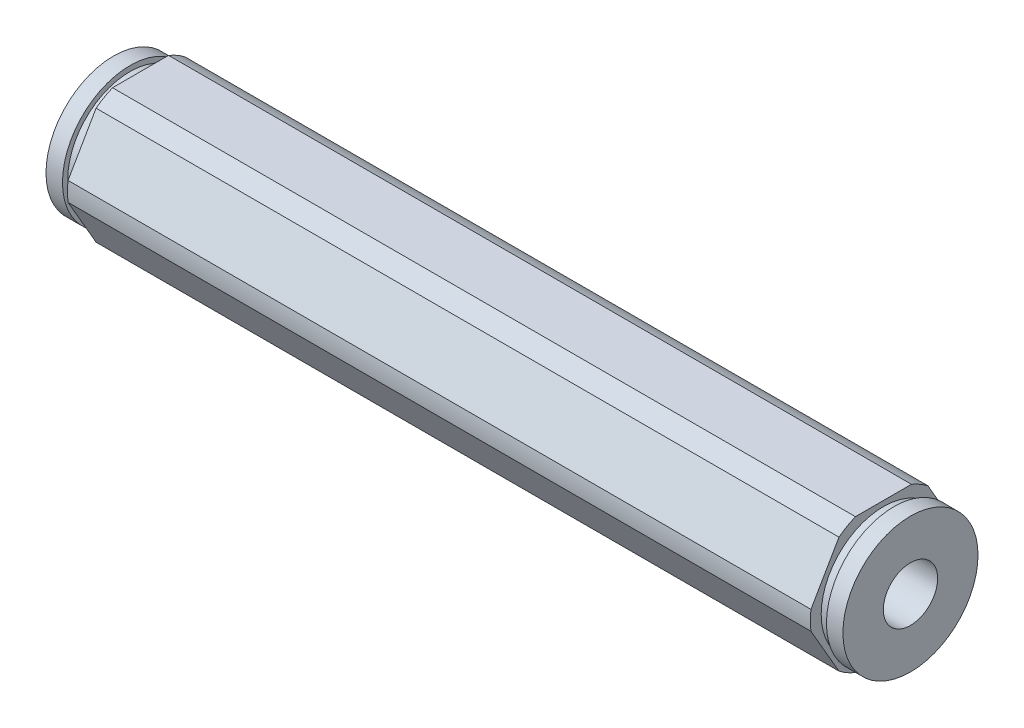
ISO-10303-21;
HEADER;
FILE_DESCRIPTION(('STEP AP214'),'2;1');
FILE_NAME('part.step','',(''),(''),'','','');
FILE_SCHEMA(('AUTOMOTIVE_DESIGN { 1 0 10303 214 1 1 1 1 }'));
ENDSEC;
DATA;
#1=APPLICATION_CONTEXT('core data for automotive mechanical design processes');
#2=APPLICATION_PROTOCOL_DEFINITION('international standard','automotive_design',2000,#1);
#3=PRODUCT_CONTEXT('',#1,'mechanical');
#4=PRODUCT('Part','Part','',(#3));
#5=PRODUCT_RELATED_PRODUCT_CATEGORY('part','',(#4));
#6=PRODUCT_DEFINITION_FORMATION('','',#4);
#7=PRODUCT_DEFINITION_CONTEXT('part definition',#1,'design');
#8=PRODUCT_DEFINITION('design','',#6,#7);
#9=PRODUCT_DEFINITION_SHAPE('','',#8);
#10=(LENGTH_UNIT() NAMED_UNIT(*) SI_UNIT(.MILLI.,.METRE.));
#11=(NAMED_UNIT(*) PLANE_ANGLE_UNIT() SI_UNIT($,.RADIAN.));
#12=(NAMED_UNIT(*) SI_UNIT($,.STERADIAN.) SOLID_ANGLE_UNIT());
#13=UNCERTAINTY_MEASURE_WITH_UNIT(LENGTH_MEASURE(1.E-05),#10,'distance_accuracy_value','');
#14=(GEOMETRIC_REPRESENTATION_CONTEXT(3) GLOBAL_UNCERTAINTY_ASSIGNED_CONTEXT((#13)) GLOBAL_UNIT_ASSIGNED_CONTEXT((#10,
#11,#12)) REPRESENTATION_CONTEXT('',''));
#15=CARTESIAN_POINT('',(0.,0.,0.));
#16=DIRECTION('',(0.,0.,1.));
#17=DIRECTION('',(1.,0.,0.));
#18=AXIS2_PLACEMENT_3D('',#15,#16,#17);
#19=CARTESIAN_POINT('',(37.465,-6.34999999999993,-3.66617420935418));
#20=DIRECTION('',(0.,0.499999999999995,0.866025403784441));
#21=DIRECTION('',(0.,-0.866025403784441,0.499999999999995));
#22=AXIS2_PLACEMENT_3D('',#19,#20,#21);
#23=PLANE('',#22);
#24=DIRECTION('',(1.,0.,0.));
#25=VECTOR('',#24,1.);
#26=CARTESIAN_POINT('',(-37.465,-5.4569605057932,-4.18177080173139));
#27=LINE('',#26,#25);
#28=CARTESIAN_POINT('',(-34.925,-5.4569605057932,-4.18177080173139));
#29=VERTEX_POINT('',#28);
#30=CARTESIAN_POINT('',(34.925,-5.4569605057932,-4.18177080173139));
#31=VERTEX_POINT('',#30);
#32=EDGE_CURVE('E252',#29,#31,#27,.T.);
#33=ORIENTED_EDGE('',*,*,#32,.F.);
#34=DIRECTION('',(0.,0.866025403784441,-0.499999999999995));
#35=VECTOR('',#34,1.);
#36=CARTESIAN_POINT('',(-34.925,-6.34999999999993,-3.66617420935418));
#37=LINE('',#36,#35);
#38=CARTESIAN_POINT('',(-34.925,-0.893039494206728,-6.816751826331));
#39=VERTEX_POINT('',#38);
#40=EDGE_CURVE('E149',#29,#39,#37,.T.);
#41=ORIENTED_EDGE('',*,*,#40,.T.);
#42=DIRECTION('',(1.,0.,0.));
#43=VECTOR('',#42,1.);
#44=CARTESIAN_POINT('',(-37.465,-0.893039494206728,-6.816751826331));
#45=LINE('',#44,#43);
#46=CARTESIAN_POINT('',(34.925,-0.893039494206728,-6.816751826331));
#47=VERTEX_POINT('',#46);
#48=EDGE_CURVE('E58',#47,#39,#45,.F.);
#49=ORIENTED_EDGE('',*,*,#48,.F.);
#50=DIRECTION('',(0.,-0.866025403784441,0.499999999999995));
#51=VECTOR('',#50,1.);
#52=CARTESIAN_POINT('',(34.925,-6.34999999999993,-3.66617420935418));
#53=LINE('',#52,#51);
#54=EDGE_CURVE('E177',#47,#31,#53,.T.);
#55=ORIENTED_EDGE('',*,*,#54,.T.);
#56=EDGE_LOOP('',(#33,#41,#49,#55));
#57=FACE_BOUND('',#56,.T.);
#58=ADVANCED_FACE('F43',(#57),#23,.F.);
#59=CARTESIAN_POINT('',(37.465,0.,-7.33234841870821));
#60=DIRECTION('',(0.,-0.500000000000001,0.866025403784438));
#61=DIRECTION('',(0.,-0.866025403784438,-0.500000000000001));
#62=AXIS2_PLACEMENT_3D('',#59,#60,#61);
#63=PLANE('',#62);
#64=DIRECTION('',(1.,0.,0.));
#65=VECTOR('',#64,1.);
#66=CARTESIAN_POINT('',(-37.465,0.893039494206712,-6.816751826331));
#67=LINE('',#66,#65);
#68=CARTESIAN_POINT('',(-34.925,0.893039494206712,-6.816751826331));
#69=VERTEX_POINT('',#68);
#70=CARTESIAN_POINT('',(34.925,0.893039494206712,-6.816751826331));
#71=VERTEX_POINT('',#70);
#72=EDGE_CURVE('E130',#69,#71,#67,.T.);
#73=ORIENTED_EDGE('',*,*,#72,.F.);
#74=DIRECTION('',(0.,0.866025403784438,0.500000000000001));
#75=VECTOR('',#74,1.);
#76=CARTESIAN_POINT('',(-34.925,0.,-7.33234841870821));
#77=LINE('',#76,#75);
#78=CARTESIAN_POINT('',(-34.925,5.45696050579327,-4.1817708017313));
#79=VERTEX_POINT('',#78);
#80=EDGE_CURVE('E142',#69,#79,#77,.T.);
#81=ORIENTED_EDGE('',*,*,#80,.T.);
#82=DIRECTION('',(1.,0.,0.));
#83=VECTOR('',#82,1.);
#84=CARTESIAN_POINT('',(-37.465,5.45696050579327,-4.1817708017313));
#85=LINE('',#84,#83);
#86=CARTESIAN_POINT('',(34.925,5.45696050579327,-4.1817708017313));
#87=VERTEX_POINT('',#86);
#88=EDGE_CURVE('E65',#87,#79,#85,.F.);
#89=ORIENTED_EDGE('',*,*,#88,.F.);
#90=DIRECTION('',(0.,-0.866025403784438,-0.500000000000001));
#91=VECTOR('',#90,1.);
#92=CARTESIAN_POINT('',(34.925,0.,-7.33234841870821));
#93=LINE('',#92,#91);
#94=EDGE_CURVE('E144',#87,#71,#93,.T.);
#95=ORIENTED_EDGE('',*,*,#94,.T.);
#96=EDGE_LOOP('',(#73,#81,#89,#95));
#97=FACE_BOUND('',#96,.T.);
#98=ADVANCED_FACE('F141',(#97),#63,.F.);
#99=CARTESIAN_POINT('',(37.465,6.34999999999998,-3.66617420935409));
#100=DIRECTION('',(0.,-1.,0.));
#101=DIRECTION('',(0.,0.,-1.));
#102=AXIS2_PLACEMENT_3D('',#99,#100,#101);
#103=PLANE('',#102);
#104=DIRECTION('',(1.,0.,0.));
#105=VECTOR('',#104,1.);
#106=CARTESIAN_POINT('',(-37.465,6.34999999999997,-2.63498102459967));
#107=LINE('',#106,#105);
#108=CARTESIAN_POINT('',(-34.925,6.34999999999997,-2.63498102459967));
#109=VERTEX_POINT('',#108);
#110=CARTESIAN_POINT('',(34.925,6.34999999999997,-2.63498102459967));
#111=VERTEX_POINT('',#110);
#112=EDGE_CURVE('E239',#109,#111,#107,.T.);
#113=ORIENTED_EDGE('',*,*,#112,.F.);
#114=DIRECTION('',(0.,0.,1.));
#115=VECTOR('',#114,1.);
#116=CARTESIAN_POINT('',(-34.925,6.34999999999998,-3.66617420935409));
#117=LINE('',#116,#115);
#118=CARTESIAN_POINT('',(-34.925,6.34999999999996,2.63498102459971));
#119=VERTEX_POINT('',#118);
#120=EDGE_CURVE('E150',#109,#119,#117,.T.);
#121=ORIENTED_EDGE('',*,*,#120,.T.);
#122=DIRECTION('',(1.,0.,0.));
#123=VECTOR('',#122,1.);
#124=CARTESIAN_POINT('',(-37.465,6.34999999999996,2.63498102459971));
#125=LINE('',#124,#123);
#126=CARTESIAN_POINT('',(34.925,6.34999999999996,2.63498102459971));
#127=VERTEX_POINT('',#126);
#128=EDGE_CURVE('E216',#127,#119,#125,.F.);
#129=ORIENTED_EDGE('',*,*,#128,.F.);
#130=DIRECTION('',(0.,0.,-1.));
#131=VECTOR('',#130,1.);
#132=CARTESIAN_POINT('',(34.925,6.34999999999998,-3.66617420935409));
#133=LINE('',#132,#131);
#134=EDGE_CURVE('E173',#127,#111,#133,.T.);
#135=ORIENTED_EDGE('',*,*,#134,.T.);
#136=EDGE_LOOP('',(#113,#121,#129,#135));
#137=FACE_BOUND('',#136,.T.);
#138=ADVANCED_FACE('F304',(#137),#103,.F.);
#139=CARTESIAN_POINT('',(37.465,6.34999999999995,3.66617420935414));
#140=DIRECTION('',(0.,-0.499999999999995,-0.866025403784442));
#141=DIRECTION('',(0.,0.866025403784442,-0.499999999999995));
#142=AXIS2_PLACEMENT_3D('',#139,#140,#141);
#143=PLANE('',#142);
#144=DIRECTION('',(1.,0.,0.));
#145=VECTOR('',#144,1.);
#146=CARTESIAN_POINT('',(-37.465,5.45696050579324,4.18177080173134));
#147=LINE('',#146,#145);
#148=CARTESIAN_POINT('',(-34.925,5.45696050579324,4.18177080173134));
#149=VERTEX_POINT('',#148);
#150=CARTESIAN_POINT('',(34.925,5.45696050579324,4.18177080173134));
#151=VERTEX_POINT('',#150);
#152=EDGE_CURVE('E213',#149,#151,#147,.T.);
#153=ORIENTED_EDGE('',*,*,#152,.F.);
#154=DIRECTION('',(0.,-0.866025403784442,0.499999999999995));
#155=VECTOR('',#154,1.);
#156=CARTESIAN_POINT('',(-34.925,6.34999999999995,3.66617420935414));
#157=LINE('',#156,#155);
#158=CARTESIAN_POINT('',(-34.925,0.89303949420666,6.81675182633101));
#159=VERTEX_POINT('',#158);
#160=EDGE_CURVE('E155',#149,#159,#157,.T.);
#161=ORIENTED_EDGE('',*,*,#160,.T.);
#162=DIRECTION('',(1.,0.,0.));
#163=VECTOR('',#162,1.);
#164=CARTESIAN_POINT('',(-37.465,0.893039494206654,6.81675182633101));
#165=LINE('',#164,#163);
#166=CARTESIAN_POINT('',(34.925,0.893039494206654,6.81675182633101));
#167=VERTEX_POINT('',#166);
#168=EDGE_CURVE('E243',#167,#159,#165,.F.);
#169=ORIENTED_EDGE('',*,*,#168,.F.);
#170=DIRECTION('',(0.,0.866025403784442,-0.499999999999995));
#171=VECTOR('',#170,1.);
#172=CARTESIAN_POINT('',(34.925,6.34999999999995,3.66617420935414));
#173=LINE('',#172,#171);
#174=EDGE_CURVE('E170',#167,#151,#173,.T.);
#175=ORIENTED_EDGE('',*,*,#174,.T.);
#176=EDGE_LOOP('',(#153,#161,#169,#175));
#177=FACE_BOUND('',#176,.T.);
#178=ADVANCED_FACE('F220',(#177),#143,.F.);
#179=CARTESIAN_POINT('',(37.465,0.,7.33234841870821));
#180=DIRECTION('',(0.,0.500000000000007,-0.866025403784435));
#181=DIRECTION('',(0.,0.866025403784435,0.500000000000007));
#182=AXIS2_PLACEMENT_3D('',#179,#180,#181);
#183=PLANE('',#182);
#184=DIRECTION('',(1.,0.,0.));
#185=VECTOR('',#184,1.);
#186=CARTESIAN_POINT('',(-37.465,-0.893039494206757,6.81675182633099));
#187=LINE('',#186,#185);
#188=CARTESIAN_POINT('',(-34.925,-0.893039494206757,6.81675182633099));
#189=VERTEX_POINT('',#188);
#190=CARTESIAN_POINT('',(34.925,-0.893039494206757,6.81675182633099));
#191=VERTEX_POINT('',#190);
#192=EDGE_CURVE('E245',#189,#191,#187,.T.);
#193=ORIENTED_EDGE('',*,*,#192,.F.);
#194=DIRECTION('',(0.,-0.866025403784435,-0.500000000000007));
#195=VECTOR('',#194,1.);
#196=CARTESIAN_POINT('',(-34.925,0.,7.33234841870821));
#197=LINE('',#196,#195);
#198=CARTESIAN_POINT('',(-34.925,-5.4569605057933,4.18177080173127));
#199=VERTEX_POINT('',#198);
#200=EDGE_CURVE('E225',#189,#199,#197,.T.);
#201=ORIENTED_EDGE('',*,*,#200,.T.);
#202=DIRECTION('',(1.,0.,0.));
#203=VECTOR('',#202,1.);
#204=CARTESIAN_POINT('',(-37.465,-5.4569605057933,4.18177080173127));
#205=LINE('',#204,#203);
#206=CARTESIAN_POINT('',(34.925,-5.4569605057933,4.18177080173127));
#207=VERTEX_POINT('',#206);
#208=EDGE_CURVE('E248',#207,#199,#205,.F.);
#209=ORIENTED_EDGE('',*,*,#208,.F.);
#210=DIRECTION('',(0.,0.866025403784435,0.500000000000007));
#211=VECTOR('',#210,1.);
#212=CARTESIAN_POINT('',(34.925,0.,7.33234841870821));
#213=LINE('',#212,#211);
#214=EDGE_CURVE('E167',#207,#191,#213,.T.);
#215=ORIENTED_EDGE('',*,*,#214,.T.);
#216=EDGE_LOOP('',(#193,#201,#209,#215));
#217=FACE_BOUND('',#216,.T.);
#218=ADVANCED_FACE('F323',(#217),#183,.F.);
#219=CARTESIAN_POINT('',(37.465,-6.35,3.66617420935405));
#220=DIRECTION('',(0.,1.,0.));
#221=DIRECTION('',(0.,0.,1.));
#222=AXIS2_PLACEMENT_3D('',#219,#220,#221);
#223=PLANE('',#222);
#224=DIRECTION('',(1.,0.,0.));
#225=VECTOR('',#224,1.);
#226=CARTESIAN_POINT('',(-37.465,-6.34999999999999,2.63498102459963));
#227=LINE('',#226,#225);
#228=CARTESIAN_POINT('',(-34.925,-6.34999999999999,2.63498102459963));
#229=VERTEX_POINT('',#228);
#230=CARTESIAN_POINT('',(34.925,-6.34999999999999,2.63498102459963));
#231=VERTEX_POINT('',#230);
#232=EDGE_CURVE('E196',#229,#231,#227,.T.);
#233=ORIENTED_EDGE('',*,*,#232,.F.);
#234=DIRECTION('',(0.,0.,-1.));
#235=VECTOR('',#234,1.);
#236=CARTESIAN_POINT('',(-34.925,-6.35,3.66617420935405));
#237=LINE('',#236,#235);
#238=CARTESIAN_POINT('',(-34.925,-6.34999999999994,-2.63498102459976));
#239=VERTEX_POINT('',#238);
#240=EDGE_CURVE('E137',#229,#239,#237,.T.);
#241=ORIENTED_EDGE('',*,*,#240,.T.);
#242=DIRECTION('',(1.,0.,0.));
#243=VECTOR('',#242,1.);
#244=CARTESIAN_POINT('',(-37.465,-6.34999999999994,-2.63498102459976));
#245=LINE('',#244,#243);
#246=CARTESIAN_POINT('',(34.925,-6.34999999999994,-2.63498102459976));
#247=VERTEX_POINT('',#246);
#248=EDGE_CURVE('E194',#247,#239,#245,.F.);
#249=ORIENTED_EDGE('',*,*,#248,.F.);
#250=DIRECTION('',(0.,0.,1.));
#251=VECTOR('',#250,1.);
#252=CARTESIAN_POINT('',(34.925,-6.35,3.66617420935405));
#253=LINE('',#252,#251);
#254=EDGE_CURVE('E183',#247,#231,#253,.T.);
#255=ORIENTED_EDGE('',*,*,#254,.T.);
#256=EDGE_LOOP('',(#233,#241,#249,#255));
#257=FACE_BOUND('',#256,.T.);
#258=ADVANCED_FACE('F193',(#257),#223,.F.);
#259=CARTESIAN_POINT('',(34.925,0.,8.89));
#260=DIRECTION('',(-1.,0.,0.));
#261=DIRECTION('',(0.,0.,1.));
#262=AXIS2_PLACEMENT_3D('',#259,#260,#261);
#263=PLANE('',#262);
#264=CARTESIAN_POINT('',(34.925,0.,0.));
#265=DIRECTION('',(-1.,0.,0.));
#266=DIRECTION('',(0.,0.,1.));
#267=AXIS2_PLACEMENT_3D('',#264,#265,#266);
#268=CIRCLE('',#267,5.8547);
#269=CARTESIAN_POINT('',(34.925,0.,5.8547));
#270=VERTEX_POINT('',#269);
#271=EDGE_CURVE('E164',#270,#270,#268,.T.);
#272=ORIENTED_EDGE('',*,*,#271,.T.);
#273=EDGE_LOOP('',(#272));
#274=FACE_BOUND('',#273,.T.);
#275=CARTESIAN_POINT('',(34.925,0.,0.));
#276=DIRECTION('',(-1.,0.,0.));
#277=DIRECTION('',(0.,0.,1.));
#278=AXIS2_PLACEMENT_3D('',#275,#276,#277);
#279=CIRCLE('',#278,6.875);
#280=EDGE_CURVE('E241',#151,#127,#279,.T.);
#281=ORIENTED_EDGE('',*,*,#280,.F.);
#282=ORIENTED_EDGE('',*,*,#174,.F.);
#283=EDGE_CURVE('E223',#191,#167,#279,.T.);
#284=ORIENTED_EDGE('',*,*,#283,.F.);
#285=ORIENTED_EDGE('',*,*,#214,.F.);
#286=EDGE_CURVE('E247',#231,#207,#279,.T.);
#287=ORIENTED_EDGE('',*,*,#286,.F.);
#288=ORIENTED_EDGE('',*,*,#254,.F.);
#289=EDGE_CURVE('E251',#31,#247,#279,.T.);
#290=ORIENTED_EDGE('',*,*,#289,.F.);
#291=ORIENTED_EDGE('',*,*,#54,.F.);
#292=EDGE_CURVE('E255',#71,#47,#279,.T.);
#293=ORIENTED_EDGE('',*,*,#292,.F.);
#294=ORIENTED_EDGE('',*,*,#94,.F.);
#295=EDGE_CURVE('E237',#111,#87,#279,.T.);
#296=ORIENTED_EDGE('',*,*,#295,.F.);
#297=ORIENTED_EDGE('',*,*,#134,.F.);
#298=EDGE_LOOP('',(#281,#282,#284,#285,#287,#288,#290,#291,#293,#294,#296,#297));
#299=FACE_BOUND('',#298,.T.);
#300=ADVANCED_FACE('F309',(#274,#299),#263,.F.);
#301=CARTESIAN_POINT('',(-34.925,0.,8.89));
#302=DIRECTION('',(1.,0.,0.));
#303=DIRECTION('',(0.,0.,1.));
#304=AXIS2_PLACEMENT_3D('',#301,#302,#303);
#305=PLANE('',#304);
#306=CARTESIAN_POINT('',(-34.925,0.,0.));
#307=DIRECTION('',(-1.,0.,0.));
#308=DIRECTION('',(0.,0.,1.));
#309=AXIS2_PLACEMENT_3D('',#306,#307,#308);
#310=CIRCLE('',#309,5.8547);
#311=CARTESIAN_POINT('',(-34.925,0.,5.8547));
#312=VERTEX_POINT('',#311);
#313=EDGE_CURVE('E226',#312,#312,#310,.T.);
#314=ORIENTED_EDGE('',*,*,#313,.F.);
#315=EDGE_LOOP('',(#314));
#316=FACE_BOUND('',#315,.T.);
#317=CARTESIAN_POINT('',(-34.925,0.,0.));
#318=DIRECTION('',(1.,0.,0.));
#319=DIRECTION('',(0.,0.,-1.));
#320=AXIS2_PLACEMENT_3D('',#317,#318,#319);
#321=CIRCLE('',#320,6.875);
#322=EDGE_CURVE('E12',#79,#109,#321,.T.);
#323=ORIENTED_EDGE('',*,*,#322,.F.);
#324=ORIENTED_EDGE('',*,*,#80,.F.);
#325=EDGE_CURVE('E46',#39,#69,#321,.T.);
#326=ORIENTED_EDGE('',*,*,#325,.F.);
#327=ORIENTED_EDGE('',*,*,#40,.F.);
#328=EDGE_CURVE('E136',#239,#29,#321,.T.);
#329=ORIENTED_EDGE('',*,*,#328,.F.);
#330=ORIENTED_EDGE('',*,*,#240,.F.);
#331=EDGE_CURVE('E200',#199,#229,#321,.T.);
#332=ORIENTED_EDGE('',*,*,#331,.F.);
#333=ORIENTED_EDGE('',*,*,#200,.F.);
#334=EDGE_CURVE('E204',#159,#189,#321,.T.);
#335=ORIENTED_EDGE('',*,*,#334,.F.);
#336=ORIENTED_EDGE('',*,*,#160,.F.);
#337=EDGE_CURVE('E51',#119,#149,#321,.T.);
#338=ORIENTED_EDGE('',*,*,#337,.F.);
#339=ORIENTED_EDGE('',*,*,#120,.F.);
#340=EDGE_LOOP('',(#323,#324,#326,#327,#329,#330,#332,#333,#335,#336,#338,#339));
#341=FACE_BOUND('',#340,.T.);
#342=ADVANCED_FACE('F147',(#316,#341),#305,.F.);
#343=CARTESIAN_POINT('',(0.,0.,0.));
#344=DIRECTION('',(-1.,0.,0.));
#345=DIRECTION('',(0.,0.,1.));
#346=AXIS2_PLACEMENT_3D('',#343,#344,#345);
#347=CYLINDRICAL_SURFACE('',#346,6.35);
#348=CARTESIAN_POINT('',(37.465,0.,0.));
#349=DIRECTION('',(1.,0.,0.));
#350=DIRECTION('',(0.,0.,-1.));
#351=AXIS2_PLACEMENT_3D('',#348,#349,#350);
#352=CIRCLE('',#351,6.35);
#353=CARTESIAN_POINT('',(37.465,0.,-6.35));
#354=VERTEX_POINT('',#353);
#355=EDGE_CURVE('E180',#354,#354,#352,.F.);
#356=ORIENTED_EDGE('',*,*,#355,.T.);
#357=EDGE_LOOP('',(#356));
#358=FACE_BOUND('',#357,.T.);
#359=CARTESIAN_POINT('',(35.9156,0.,0.));
#360=DIRECTION('',(-1.,0.,0.));
#361=DIRECTION('',(0.,0.,1.));
#362=AXIS2_PLACEMENT_3D('',#359,#360,#361);
#363=CIRCLE('',#362,6.35);
#364=CARTESIAN_POINT('',(35.9156,0.,6.35));
#365=VERTEX_POINT('',#364);
#366=EDGE_CURVE('E152',#365,#365,#363,.T.);
#367=ORIENTED_EDGE('',*,*,#366,.F.);
#368=EDGE_LOOP('',(#367));
#369=FACE_BOUND('',#368,.T.);
#370=ADVANCED_FACE('F281',(#358,#369),#347,.T.);
#371=CARTESIAN_POINT('',(0.,0.,0.));
#372=DIRECTION('',(-1.,0.,0.));
#373=DIRECTION('',(0.,0.,1.));
#374=AXIS2_PLACEMENT_3D('',#371,#372,#373);
#375=CYLINDRICAL_SURFACE('',#374,5.8547);
#376=ORIENTED_EDGE('',*,*,#271,.F.);
#377=EDGE_LOOP('',(#376));
#378=FACE_BOUND('',#377,.T.);
#379=CARTESIAN_POINT('',(35.9156,0.,0.));
#380=DIRECTION('',(-1.,0.,0.));
#381=DIRECTION('',(0.,0.,1.));
#382=AXIS2_PLACEMENT_3D('',#379,#380,#381);
#383=CIRCLE('',#382,5.8547);
#384=CARTESIAN_POINT('',(35.9156,0.,5.8547));
#385=VERTEX_POINT('',#384);
#386=EDGE_CURVE('E161',#385,#385,#383,.T.);
#387=ORIENTED_EDGE('',*,*,#386,.T.);
#388=EDGE_LOOP('',(#387));
#389=FACE_BOUND('',#388,.T.);
#390=ADVANCED_FACE('F284',(#378,#389),#375,.T.);
#391=CARTESIAN_POINT('',(35.9156,0.,5.8547));
#392=DIRECTION('',(1.,0.,0.));
#393=DIRECTION('',(0.,0.,-1.));
#394=AXIS2_PLACEMENT_3D('',#391,#392,#393);
#395=PLANE('',#394);
#396=ORIENTED_EDGE('',*,*,#386,.F.);
#397=EDGE_LOOP('',(#396));
#398=FACE_BOUND('',#397,.T.);
#399=ORIENTED_EDGE('',*,*,#366,.T.);
#400=EDGE_LOOP('',(#399));
#401=FACE_BOUND('',#400,.T.);
#402=ADVANCED_FACE('F277',(#398,#401),#395,.F.);
#403=CARTESIAN_POINT('',(37.465,0.,0.));
#404=DIRECTION('',(1.,0.,0.));
#405=DIRECTION('',(0.,0.,-1.));
#406=AXIS2_PLACEMENT_3D('',#403,#404,#405);
#407=PLANE('',#406);
#408=CARTESIAN_POINT('',(37.465,0.,0.));
#409=DIRECTION('',(1.,0.,0.));
#410=DIRECTION('',(0.,0.,-1.));
#411=AXIS2_PLACEMENT_3D('',#408,#409,#410);
#412=CIRCLE('',#411,2.5527);
#413=CARTESIAN_POINT('',(37.465,0.,-2.5527));
#414=VERTEX_POINT('',#413);
#415=EDGE_CURVE('E258',#414,#414,#412,.T.);
#416=ORIENTED_EDGE('',*,*,#415,.F.);
#417=EDGE_LOOP('',(#416));
#418=FACE_BOUND('',#417,.T.);
#419=ORIENTED_EDGE('',*,*,#355,.F.);
#420=EDGE_LOOP('',(#419));
#421=FACE_BOUND('',#420,.T.);
#422=ADVANCED_FACE('F273',(#418,#421),#407,.T.);
#423=CARTESIAN_POINT('',(0.,0.,0.));
#424=DIRECTION('',(1.,0.,0.));
#425=DIRECTION('',(0.,0.,1.));
#426=AXIS2_PLACEMENT_3D('',#423,#424,#425);
#427=CYLINDRICAL_SURFACE('',#426,6.35);
#428=CARTESIAN_POINT('',(-37.465,0.,0.));
#429=DIRECTION('',(1.,0.,0.));
#430=DIRECTION('',(0.,0.,-1.));
#431=AXIS2_PLACEMENT_3D('',#428,#429,#430);
#432=CIRCLE('',#431,6.35);
#433=CARTESIAN_POINT('',(-37.465,0.,-6.35));
#434=VERTEX_POINT('',#433);
#435=EDGE_CURVE('E186',#434,#434,#432,.F.);
#436=ORIENTED_EDGE('',*,*,#435,.F.);
#437=EDGE_LOOP('',(#436));
#438=FACE_BOUND('',#437,.T.);
#439=CARTESIAN_POINT('',(-35.9156,0.,0.));
#440=DIRECTION('',(-1.,0.,0.));
#441=DIRECTION('',(0.,0.,1.));
#442=AXIS2_PLACEMENT_3D('',#439,#440,#441);
#443=CIRCLE('',#442,6.35);
#444=CARTESIAN_POINT('',(-35.9156,0.,6.35));
#445=VERTEX_POINT('',#444);
#446=EDGE_CURVE('E234',#445,#445,#443,.T.);
#447=ORIENTED_EDGE('',*,*,#446,.T.);
#448=EDGE_LOOP('',(#447));
#449=FACE_BOUND('',#448,.T.);
#450=ADVANCED_FACE('F276',(#438,#449),#427,.T.);
#451=CARTESIAN_POINT('',(0.,0.,0.));
#452=DIRECTION('',(1.,0.,0.));
#453=DIRECTION('',(0.,0.,1.));
#454=AXIS2_PLACEMENT_3D('',#451,#452,#453);
#455=CYLINDRICAL_SURFACE('',#454,5.8547);
#456=ORIENTED_EDGE('',*,*,#313,.T.);
#457=EDGE_LOOP('',(#456));
#458=FACE_BOUND('',#457,.T.);
#459=CARTESIAN_POINT('',(-35.9156,0.,0.));
#460=DIRECTION('',(-1.,0.,0.));
#461=DIRECTION('',(0.,0.,1.));
#462=AXIS2_PLACEMENT_3D('',#459,#460,#461);
#463=CIRCLE('',#462,5.8547);
#464=CARTESIAN_POINT('',(-35.9156,0.,5.8547));
#465=VERTEX_POINT('',#464);
#466=EDGE_CURVE('E231',#465,#465,#463,.T.);
#467=ORIENTED_EDGE('',*,*,#466,.F.);
#468=EDGE_LOOP('',(#467));
#469=FACE_BOUND('',#468,.T.);
#470=ADVANCED_FACE('F347',(#458,#469),#455,.T.);
#471=CARTESIAN_POINT('',(-35.9156,0.,5.8547));
#472=DIRECTION('',(-1.,0.,0.));
#473=DIRECTION('',(0.,0.,-1.));
#474=AXIS2_PLACEMENT_3D('',#471,#472,#473);
#475=PLANE('',#474);
#476=ORIENTED_EDGE('',*,*,#466,.T.);
#477=EDGE_LOOP('',(#476));
#478=FACE_BOUND('',#477,.T.);
#479=ORIENTED_EDGE('',*,*,#446,.F.);
#480=EDGE_LOOP('',(#479));
#481=FACE_BOUND('',#480,.T.);
#482=ADVANCED_FACE('F332',(#478,#481),#475,.F.);
#483=CARTESIAN_POINT('',(-37.465,0.,0.));
#484=DIRECTION('',(1.,0.,0.));
#485=DIRECTION('',(0.,0.,-1.));
#486=AXIS2_PLACEMENT_3D('',#483,#484,#485);
#487=PLANE('',#486);
#488=CARTESIAN_POINT('',(-37.465,0.,0.));
#489=DIRECTION('',(1.,0.,0.));
#490=DIRECTION('',(0.,0.,-1.));
#491=AXIS2_PLACEMENT_3D('',#488,#489,#490);
#492=CIRCLE('',#491,2.5527);
#493=CARTESIAN_POINT('',(-37.465,0.,-2.5527));
#494=VERTEX_POINT('',#493);
#495=EDGE_CURVE('E145',#494,#494,#492,.T.);
#496=ORIENTED_EDGE('',*,*,#495,.T.);
#497=EDGE_LOOP('',(#496));
#498=FACE_BOUND('',#497,.T.);
#499=ORIENTED_EDGE('',*,*,#435,.T.);
#500=EDGE_LOOP('',(#499));
#501=FACE_BOUND('',#500,.T.);
#502=ADVANCED_FACE('F264',(#498,#501),#487,.F.);
#503=CARTESIAN_POINT('',(-37.465,0.,0.));
#504=DIRECTION('',(1.,0.,0.));
#505=DIRECTION('',(0.,0.,-1.));
#506=AXIS2_PLACEMENT_3D('',#503,#504,#505);
#507=CYLINDRICAL_SURFACE('',#506,2.5527);
#508=ORIENTED_EDGE('',*,*,#495,.F.);
#509=EDGE_LOOP('',(#508));
#510=FACE_BOUND('',#509,.T.);
#511=ORIENTED_EDGE('',*,*,#415,.T.);
#512=EDGE_LOOP('',(#511));
#513=FACE_BOUND('',#512,.T.);
#514=ADVANCED_FACE('F267',(#510,#513),#507,.F.);
#515=CARTESIAN_POINT('',(-37.465,0.,0.));
#516=DIRECTION('',(1.,0.,0.));
#517=DIRECTION('',(0.,0.,-1.));
#518=AXIS2_PLACEMENT_3D('',#515,#516,#517);
#519=CYLINDRICAL_SURFACE('',#518,6.875);
#520=ORIENTED_EDGE('',*,*,#292,.T.);
#521=ORIENTED_EDGE('',*,*,#48,.T.);
#522=ORIENTED_EDGE('',*,*,#325,.T.);
#523=ORIENTED_EDGE('',*,*,#72,.T.);
#524=EDGE_LOOP('',(#520,#521,#522,#523));
#525=FACE_BOUND('',#524,.T.);
#526=ADVANCED_FACE('F129',(#525),#519,.T.);
#527=ORIENTED_EDGE('',*,*,#289,.T.);
#528=ORIENTED_EDGE('',*,*,#248,.T.);
#529=ORIENTED_EDGE('',*,*,#328,.T.);
#530=ORIENTED_EDGE('',*,*,#32,.T.);
#531=EDGE_LOOP('',(#527,#528,#529,#530));
#532=FACE_BOUND('',#531,.T.);
#533=ADVANCED_FACE('F307',(#532),#519,.T.);
#534=ORIENTED_EDGE('',*,*,#286,.T.);
#535=ORIENTED_EDGE('',*,*,#208,.T.);
#536=ORIENTED_EDGE('',*,*,#331,.T.);
#537=ORIENTED_EDGE('',*,*,#232,.T.);
#538=EDGE_LOOP('',(#534,#535,#536,#537));
#539=FACE_BOUND('',#538,.T.);
#540=ADVANCED_FACE('F366',(#539),#519,.T.);
#541=ORIENTED_EDGE('',*,*,#283,.T.);
#542=ORIENTED_EDGE('',*,*,#168,.T.);
#543=ORIENTED_EDGE('',*,*,#334,.T.);
#544=ORIENTED_EDGE('',*,*,#192,.T.);
#545=EDGE_LOOP('',(#541,#542,#543,#544));
#546=FACE_BOUND('',#545,.T.);
#547=ADVANCED_FACE('F361',(#546),#519,.T.);
#548=ORIENTED_EDGE('',*,*,#280,.T.);
#549=ORIENTED_EDGE('',*,*,#128,.T.);
#550=ORIENTED_EDGE('',*,*,#337,.T.);
#551=ORIENTED_EDGE('',*,*,#152,.T.);
#552=EDGE_LOOP('',(#548,#549,#550,#551));
#553=FACE_BOUND('',#552,.T.);
#554=ADVANCED_FACE('F212',(#553),#519,.T.);
#555=ORIENTED_EDGE('',*,*,#295,.T.);
#556=ORIENTED_EDGE('',*,*,#88,.T.);
#557=ORIENTED_EDGE('',*,*,#322,.T.);
#558=ORIENTED_EDGE('',*,*,#112,.T.);
#559=EDGE_LOOP('',(#555,#556,#557,#558));
#560=FACE_BOUND('',#559,.T.);
#561=ADVANCED_FACE('F314',(#560),#519,.T.);
#562=CLOSED_SHELL('',(#58,#98,#138,#178,#218,#258,#300,#342,#370,#390,#402,#422,#450,#470,#482,
#502,#514,#526,#533,#540,#547,#554,#561));
#563=MANIFOLD_SOLID_BREP('B2',#562);
#564=ADVANCED_BREP_SHAPE_REPRESENTATION('',(#18,#563),#14);
#565=SHAPE_DEFINITION_REPRESENTATION(#9,#564);
ENDSEC;
END-ISO-10303-21;
